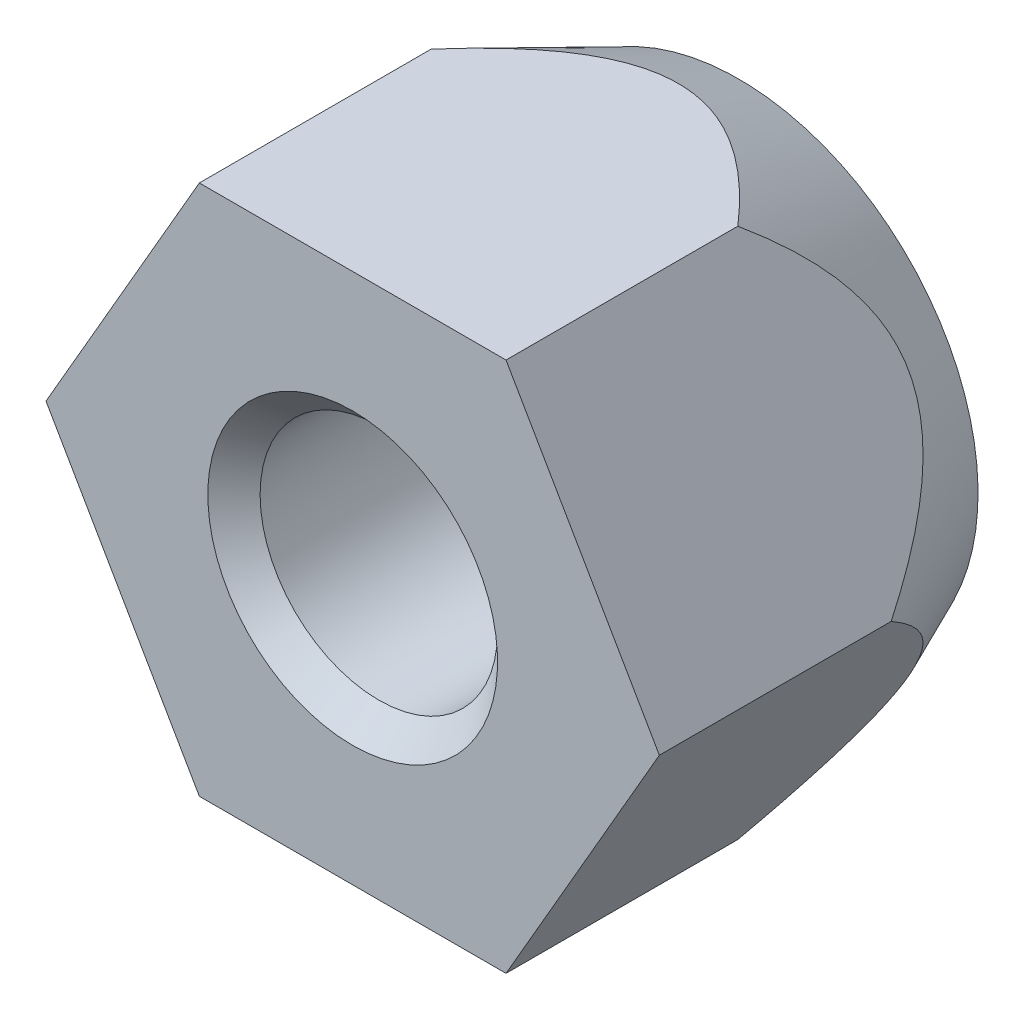
ISO-10303-21;
HEADER;
FILE_DESCRIPTION(('STEP AP214'),'2;1');
FILE_NAME('part.step','',(''),(''),'','','');
FILE_SCHEMA(('AUTOMOTIVE_DESIGN { 1 0 10303 214 1 1 1 1 }'));
ENDSEC;
DATA;
#1=APPLICATION_CONTEXT('core data for automotive mechanical design processes');
#2=APPLICATION_PROTOCOL_DEFINITION('international standard','automotive_design',2000,#1);
#3=PRODUCT_CONTEXT('',#1,'mechanical');
#4=PRODUCT('Part','Part','',(#3));
#5=PRODUCT_RELATED_PRODUCT_CATEGORY('part','',(#4));
#6=PRODUCT_DEFINITION_FORMATION('','',#4);
#7=PRODUCT_DEFINITION_CONTEXT('part definition',#1,'design');
#8=PRODUCT_DEFINITION('design','',#6,#7);
#9=PRODUCT_DEFINITION_SHAPE('','',#8);
#10=(LENGTH_UNIT() NAMED_UNIT(*) SI_UNIT(.MILLI.,.METRE.));
#11=(NAMED_UNIT(*) PLANE_ANGLE_UNIT() SI_UNIT($,.RADIAN.));
#12=(NAMED_UNIT(*) SI_UNIT($,.STERADIAN.) SOLID_ANGLE_UNIT());
#13=UNCERTAINTY_MEASURE_WITH_UNIT(LENGTH_MEASURE(1.E-05),#10,'distance_accuracy_value','');
#14=(GEOMETRIC_REPRESENTATION_CONTEXT(3) GLOBAL_UNCERTAINTY_ASSIGNED_CONTEXT((#13)) GLOBAL_UNIT_ASSIGNED_CONTEXT((#10,
#11,#12)) REPRESENTATION_CONTEXT('',''));
#15=CARTESIAN_POINT('',(0.,0.,0.));
#16=DIRECTION('',(0.,0.,1.));
#17=DIRECTION('',(1.,0.,0.));
#18=AXIS2_PLACEMENT_3D('',#15,#16,#17);
#19=CARTESIAN_POINT('',(1.5877125,2.7499987178122,-4.));
#20=DIRECTION('',(-0.866025403784438,-0.5,0.));
#21=DIRECTION('',(-0.5,0.866025403784439,0.));
#22=AXIS2_PLACEMENT_3D('',#19,#20,#21);
#23=PLANE('',#22);
#24=CARTESIAN_POINT('',(1.58771162446911,2.75000023427618,-2.399998));
#25=CARTESIAN_POINT('',(1.60310770754918,2.72333343614396,-2.43516350072012));
#26=CARTESIAN_POINT('',(1.61869154074512,2.6963414452719,-2.4699996868728));
#27=CARTESIAN_POINT('',(1.65028446627912,2.64162089308727,-2.53890977045152));
#28=CARTESIAN_POINT('',(1.66629368050588,2.61389212065727,-2.57298344412069));
#29=CARTESIAN_POINT('',(1.71525469450568,2.52908915681953,-2.67435959406448));
#30=CARTESIAN_POINT('',(1.74891920766384,2.47078050961753,-2.74030673801197));
#31=CARTESIAN_POINT('',(1.81981394050737,2.34798723034352,-2.86945688409846));
#32=CARTESIAN_POINT('',(1.85712879987133,2.28335599804785,-2.93247626108965));
#33=CARTESIAN_POINT('',(1.93469295394802,2.14901094234092,-3.05048227661869));
#34=CARTESIAN_POINT('',(1.97493218931774,2.07931454222285,-3.10549466349525));
#35=CARTESIAN_POINT('',(2.05130961529552,1.94702495987799,-3.1949305649157));
#36=CARTESIAN_POINT('',(2.08687336140756,1.88542674470447,-3.23127830379709));
#37=CARTESIAN_POINT('',(2.16008694403933,1.75861709978209,-3.29294193808089));
#38=CARTESIAN_POINT('',(2.19771990730494,1.69343489536668,-3.31833541803646));
#39=CARTESIAN_POINT('',(2.27530846235096,1.55904757594112,-3.35557240045519));
#40=CARTESIAN_POINT('',(2.3152907771711,1.48979617526843,-3.36720268887337));
#41=CARTESIAN_POINT('',(2.39564121698592,1.35062513109865,-3.3741594113299));
#42=CARTESIAN_POINT('',(2.43600944388658,1.28070531109524,-3.36948141327948));
#43=CARTESIAN_POINT('',(2.50994038252395,1.15265316912405,-3.34643657091398));
#44=CARTESIAN_POINT('',(2.54366847800623,1.09423439410621,-3.33006498957134));
#45=CARTESIAN_POINT('',(2.60957879236017,0.980074380902352,-3.28777521974059));
#46=CARTESIAN_POINT('',(2.64175981137018,0.924335220937676,-3.26184975241651));
#47=CARTESIAN_POINT('',(2.72934328345191,0.772636197388834,-3.17890057324615));
#48=CARTESIAN_POINT('',(2.7827531965352,0.680127514300735,-3.11358096697681));
#49=CARTESIAN_POINT('',(2.88452836409291,0.503847753141946,-2.96841709245939));
#50=CARTESIAN_POINT('',(2.93286320442841,0.420129353905126,-2.88849234042751));
#51=CARTESIAN_POINT('',(3.01410562020114,0.279413362057125,-2.74052719974376));
#52=CARTESIAN_POINT('',(3.04789124222314,0.220894948149705,-2.6743737303716));
#53=CARTESIAN_POINT('',(3.11315520079641,0.107854455997726,-2.53917870657911));
#54=CARTESIAN_POINT('',(3.14465646201646,0.0532926710621017,-2.47018164225687));
#55=CARTESIAN_POINT('',(3.17542587553089,-1.51646398329143E-06,-2.399998));
#56=B_SPLINE_CURVE_WITH_KNOTS('',3,(#24,#25,#26,#27,#28,#29,#30,#31,#32,#33,#34,#35,#36,#37,#38,
#39,#40,#41,#42,#43,#44,#45,#46,#47,#48,#49,#50,#51,#52,#53,#54,#55),.UNSPECIFIED.,.F.,.F.,(4,2,
2,2,2,2,2,2,2,2,2,2,2,2,2,4),(0.,0.140219214652364,0.280479050481833,0.563020685648127,
0.855709989314344,1.14743623923759,1.38640310096866,1.62364850196812,1.86452301292057,
2.10546299123102,2.31287808040015,2.52045152107709,2.89389138227835,3.26945484953458,
3.55299005498283,3.83310341091259),.UNSPECIFIED.);
#57=CARTESIAN_POINT('',(1.5877125,2.7499987178122,-2.4));
#58=VERTEX_POINT('',#57);
#59=CARTESIAN_POINT('',(3.175425,0.,-2.4));
#60=VERTEX_POINT('',#59);
#61=EDGE_CURVE('E84',#58,#60,#56,.T.);
#62=ORIENTED_EDGE('',*,*,#61,.F.);
#63=DIRECTION('',(0.,0.,1.));
#64=VECTOR('',#63,1.);
#65=CARTESIAN_POINT('',(1.5877125,2.7499987178122,-4.));
#66=LINE('',#65,#64);
#67=CARTESIAN_POINT('',(1.5877125,2.7499987178122,0.));
#68=VERTEX_POINT('',#67);
#69=EDGE_CURVE('E69',#58,#68,#66,.T.);
#70=ORIENTED_EDGE('',*,*,#69,.T.);
#71=DIRECTION('',(0.5,-0.866025403784438,0.));
#72=VECTOR('',#71,1.);
#73=CARTESIAN_POINT('',(1.5877125,2.7499987178122,0.));
#74=LINE('',#73,#72);
#75=CARTESIAN_POINT('',(3.175425,0.,0.));
#76=VERTEX_POINT('',#75);
#77=EDGE_CURVE('E87',#68,#76,#74,.T.);
#78=ORIENTED_EDGE('',*,*,#77,.T.);
#79=DIRECTION('',(0.,0.,1.));
#80=VECTOR('',#79,1.);
#81=CARTESIAN_POINT('',(3.175425,0.,-4.));
#82=LINE('',#81,#80);
#83=EDGE_CURVE('E11',#60,#76,#82,.T.);
#84=ORIENTED_EDGE('',*,*,#83,.F.);
#85=EDGE_LOOP('',(#62,#70,#78,#84));
#86=FACE_BOUND('',#85,.T.);
#87=ADVANCED_FACE('F16',(#86),#23,.F.);
#88=CARTESIAN_POINT('',(3.175425,0.,-4.));
#89=DIRECTION('',(-0.866025403784439,0.5,0.));
#90=DIRECTION('',(0.5,0.866025403784439,0.));
#91=AXIS2_PLACEMENT_3D('',#88,#89,#90);
#92=PLANE('',#91);
#93=CARTESIAN_POINT('',(3.17542587553089,1.51646398171315E-06,-2.399998));
#94=CARTESIAN_POINT('',(3.16002979245082,-0.0266652816682433,-2.43516350072012));
#95=CARTESIAN_POINT('',(3.14444595925488,-0.0536572725403014,-2.4699996868728));
#96=CARTESIAN_POINT('',(3.11285303372088,-0.108377824724928,-2.53890977045152));
#97=CARTESIAN_POINT('',(3.09684381949412,-0.136106597154928,-2.57298344412069));
#98=CARTESIAN_POINT('',(3.04788280549432,-0.220909560992671,-2.67435959406448));
#99=CARTESIAN_POINT('',(3.01421829233616,-0.279218208194672,-2.74030673801197));
#100=CARTESIAN_POINT('',(2.94332355949263,-0.402011487468687,-2.86945688409846));
#101=CARTESIAN_POINT('',(2.90600870012867,-0.466642719764355,-2.93247626108965));
#102=CARTESIAN_POINT('',(2.82844454605198,-0.600987775471279,-3.05048227661869));
#103=CARTESIAN_POINT('',(2.78820531068226,-0.670684175589358,-3.10549466349525));
#104=CARTESIAN_POINT('',(2.71182788470448,-0.802973757934211,-3.1949305649157));
#105=CARTESIAN_POINT('',(2.67626413859244,-0.864571973107733,-3.23127830379709));
#106=CARTESIAN_POINT('',(2.60305055596067,-0.991381618030106,-3.29294193808089));
#107=CARTESIAN_POINT('',(2.56541759269506,-1.05656382244552,-3.31833541803646));
#108=CARTESIAN_POINT('',(2.48782903764904,-1.19095114187108,-3.35557240045519));
#109=CARTESIAN_POINT('',(2.4478467228289,-1.26020254254377,-3.36720268887337));
#110=CARTESIAN_POINT('',(2.36749628301408,-1.39937358671355,-3.3741594113299));
#111=CARTESIAN_POINT('',(2.32712805611342,-1.46929340671697,-3.36948141327948));
#112=CARTESIAN_POINT('',(2.25319711747604,-1.59734554868815,-3.34643657091397));
#113=CARTESIAN_POINT('',(2.21946902199376,-1.655764323706,-3.33006498957133));
#114=CARTESIAN_POINT('',(2.15355870763983,-1.76992433690985,-3.28777521974059));
#115=CARTESIAN_POINT('',(2.12137768862982,-1.82566349687453,-3.26184975241651));
#116=CARTESIAN_POINT('',(2.03379421654809,-1.97736252042337,-3.17890057324615));
#117=CARTESIAN_POINT('',(1.9803843034648,-2.06987120351147,-3.11358096697681));
#118=CARTESIAN_POINT('',(1.87860913590709,-2.24615096467026,-2.96841709245939));
#119=CARTESIAN_POINT('',(1.83027429557158,-2.32986936390708,-2.88849234042751));
#120=CARTESIAN_POINT('',(1.74903187979886,-2.47058535575508,-2.74052719974376));
#121=CARTESIAN_POINT('',(1.71524625777686,-2.5291037696625,-2.6743737303716));
#122=CARTESIAN_POINT('',(1.64998229920359,-2.64214426181448,-2.53917870657911));
#123=CARTESIAN_POINT('',(1.61848103798354,-2.6967060467501,-2.47018164225686));
#124=CARTESIAN_POINT('',(1.58771162446911,-2.75000023427618,-2.399998));
#125=B_SPLINE_CURVE_WITH_KNOTS('',3,(#93,#94,#95,#96,#97,#98,#99,#100,#101,#102,#103,#104,#105,
#106,#107,#108,#109,#110,#111,#112,#113,#114,#115,#116,#117,#118,#119,#120,#121,#122,#123,#124),
.UNSPECIFIED.,.F.,.F.,(4,2,2,2,2,2,2,2,2,2,2,2,2,2,2,4),(0.,0.140219214652364,0.280479050481833,
0.563020685648127,0.855709989314345,1.14743623923759,1.38640310096866,1.62364850196812,
1.86452301292057,2.10546299123102,2.31287808040015,2.52045152107709,2.89389138227835,
3.26945484953458,3.55299005498283,3.83310341091258),.UNSPECIFIED.);
#126=CARTESIAN_POINT('',(1.5877125,-2.7499987178122,-2.4));
#127=VERTEX_POINT('',#126);
#128=EDGE_CURVE('E31',#60,#127,#125,.T.);
#129=ORIENTED_EDGE('',*,*,#128,.F.);
#130=ORIENTED_EDGE('',*,*,#83,.T.);
#131=DIRECTION('',(-0.5,-0.866025403784439,0.));
#132=VECTOR('',#131,1.);
#133=CARTESIAN_POINT('',(3.175425,0.,0.));
#134=LINE('',#133,#132);
#135=CARTESIAN_POINT('',(1.5877125,-2.7499987178122,0.));
#136=VERTEX_POINT('',#135);
#137=EDGE_CURVE('E308',#76,#136,#134,.T.);
#138=ORIENTED_EDGE('',*,*,#137,.T.);
#139=DIRECTION('',(0.,0.,1.));
#140=VECTOR('',#139,1.);
#141=CARTESIAN_POINT('',(1.5877125,-2.7499987178122,-4.));
#142=LINE('',#141,#140);
#143=EDGE_CURVE('E25',#127,#136,#142,.T.);
#144=ORIENTED_EDGE('',*,*,#143,.F.);
#145=EDGE_LOOP('',(#129,#130,#138,#144));
#146=FACE_BOUND('',#145,.T.);
#147=ADVANCED_FACE('F158',(#146),#92,.F.);
#148=CARTESIAN_POINT('',(1.5877125,-2.7499987178122,-4.));
#149=DIRECTION('',(0.,1.,0.));
#150=DIRECTION('',(1.,0.,0.));
#151=AXIS2_PLACEMENT_3D('',#148,#149,#150);
#152=PLANE('',#151);
#153=CARTESIAN_POINT('',(-2.82688364878311,-2.7499987178122,-0.644720390647707));
#154=CARTESIAN_POINT('',(-2.77042348118378,-2.7499987178122,-0.737144879062587));
#155=CARTESIAN_POINT('',(-2.71338093303943,-2.7499987178122,-0.829219048182246));
#156=CARTESIAN_POINT('',(-2.59788143875118,-2.7499987178122,-1.01250865831265));
#157=CARTESIAN_POINT('',(-2.53942412704568,-2.7499987178122,-1.10372386873356));
#158=CARTESIAN_POINT('',(-2.42026351679757,-2.7499987178122,-1.28602405757194));
#159=CARTESIAN_POINT('',(-2.3595432745047,-2.7499987178122,-1.37709799475052));
#160=CARTESIAN_POINT('',(-2.23611909676604,-2.7499987178122,-1.55787963379908));
#161=CARTESIAN_POINT('',(-2.1734153961086,-2.7499987178122,-1.64758749552727));
#162=CARTESIAN_POINT('',(-2.04080895391195,-2.7499987178122,-1.83195898169779));
#163=CARTESIAN_POINT('',(-1.97071923500158,-2.7499987178122,-1.92648874969787));
#164=CARTESIAN_POINT('',(-1.82710591146833,-2.7499987178122,-2.11289913533671));
#165=CARTESIAN_POINT('',(-1.75358284285619,-2.7499987178122,-2.20478016289546));
#166=CARTESIAN_POINT('',(-1.60250672090551,-2.7499987178122,-2.38453117779101));
#167=CARTESIAN_POINT('',(-1.52497191566971,-2.7499987178122,-2.47241640828885));
#168=CARTESIAN_POINT('',(-1.36442290871233,-2.7499987178122,-2.64299189601321));
#169=CARTESIAN_POINT('',(-1.28141376879141,-2.7499987178122,-2.72568681804867));
#170=CARTESIAN_POINT('',(-1.15188147005702,-2.7499987178122,-2.84358486027915));
#171=CARTESIAN_POINT('',(-1.1080384755649,-2.7499987178122,-2.88173059238104));
#172=CARTESIAN_POINT('',(-1.01833468271688,-2.7499987178122,-2.95562623578186));
#173=CARTESIAN_POINT('',(-0.972473101754242,-2.7499987178122,-2.99137520405734));
#174=CARTESIAN_POINT('',(-0.878860734294628,-2.7499987178122,-3.05958188889659));
#175=CARTESIAN_POINT('',(-0.831126375369222,-2.7499987178122,-3.09206193429232));
#176=CARTESIAN_POINT('',(-0.733292096526439,-2.7499987178122,-3.15320452547621));
#177=CARTESIAN_POINT('',(-0.683193346308942,-2.7499987178122,-3.18186893265026));
#178=CARTESIAN_POINT('',(-0.562894846231666,-2.7499987178122,-3.2434000086083));
#179=CARTESIAN_POINT('',(-0.491681874326186,-2.7499987178122,-3.27434944071958));
#180=CARTESIAN_POINT('',(-0.345244211512263,-2.7499987178122,-3.32464997473509));
#181=CARTESIAN_POINT('',(-0.270024710925547,-2.7499987178122,-3.34401570323426));
#182=CARTESIAN_POINT('',(-0.116450521475255,-2.7499987178122,-3.36863062656873));
#183=CARTESIAN_POINT('',(-0.0380724208464443,-2.7499987178122,-3.37374039433587));
#184=CARTESIAN_POINT('',(0.118159929234121,-2.7499987178122,-3.3685535073509));
#185=CARTESIAN_POINT('',(0.196014053367416,-2.7499987178122,-3.35825328996217));
#186=CARTESIAN_POINT('',(0.357074960670175,-2.7499987178122,-3.32202154284974));
#187=CARTESIAN_POINT('',(0.439903747334559,-2.7499987178122,-3.29446752907141));
#188=CARTESIAN_POINT('',(0.600109064674006,-2.7499987178122,-3.22651375304557));
#189=CARTESIAN_POINT('',(0.677472243525357,-2.7499987178122,-3.18608377786454));
#190=CARTESIAN_POINT('',(0.819361637318472,-2.7499987178122,-3.100583713432));
#191=CARTESIAN_POINT('',(0.884404473486118,-2.7499987178122,-3.05634784540156));
#192=CARTESIAN_POINT('',(1.01052937748537,-2.7499987178122,-2.96250081600963));
#193=CARTESIAN_POINT('',(1.07160772241582,-2.7499987178122,-2.91288471576197));
#194=CARTESIAN_POINT('',(1.19086312526903,-2.7499987178122,-2.80926890182119));
#195=CARTESIAN_POINT('',(1.24900879652108,-2.7499987178122,-2.75523346925237));
#196=CARTESIAN_POINT('',(1.36232362988999,-2.7499987178122,-2.64421053428371));
#197=CARTESIAN_POINT('',(1.41749440333187,-2.7499987178122,-2.5872246634255));
#198=CARTESIAN_POINT('',(1.52819182425455,-2.7499987178122,-2.46792735679908));
#199=CARTESIAN_POINT('',(1.58358563856184,-2.7499987178122,-2.4054933303908));
#200=CARTESIAN_POINT('',(1.69208656074325,-2.7499987178122,-2.27866312672872));
#201=CARTESIAN_POINT('',(1.74519330027241,-2.7499987178122,-2.21426663624093));
#202=CARTESIAN_POINT('',(1.90170400659737,-2.7499987178122,-2.01869084700874));
#203=CARTESIAN_POINT('',(2.00222511903021,-2.7499987178122,-1.88520657508039));
#204=CARTESIAN_POINT('',(2.19802042611811,-2.7499987178122,-1.61373851900484));
#205=CARTESIAN_POINT('',(2.29327344163132,-2.7499987178122,-1.47573968660407));
#206=CARTESIAN_POINT('',(2.47952525010072,-2.7499987178122,-1.19688654314757));
#207=CARTESIAN_POINT('',(2.57052350410901,-2.7499987178122,-1.05603187356699));
#208=CARTESIAN_POINT('',(2.74136679859907,-2.7499987178122,-0.784704397860818));
#209=CARTESIAN_POINT('',(2.82148970608582,-2.7499987178122,-0.654405575422867));
#210=CARTESIAN_POINT('',(2.97951304815934,-2.7499987178122,-0.392449278039275));
#211=CARTESIAN_POINT('',(3.05741322555143,-2.7499987178122,-0.260791648245298));
#212=CARTESIAN_POINT('',(3.21070864388621,-2.7499987178122,0.0024322371766358));
#213=CARTESIAN_POINT('',(3.28611982747211,-2.7499987178122,0.1339892341991));
#214=CARTESIAN_POINT('',(3.43540958863565,-2.7499987178122,0.397934633843802));
#215=CARTESIAN_POINT('',(3.50928848136695,-2.7499987178122,0.530322858057896));
#216=CARTESIAN_POINT('',(3.5825506059369,-2.7499987178122,0.663047059545303));
#217=B_SPLINE_CURVE_WITH_KNOTS('',3,(#153,#154,#155,#156,#157,#158,#159,#160,#161,#162,#163,
#164,#165,#166,#167,#168,#169,#170,#171,#172,#173,#174,#175,#176,#177,#178,#179,#180,#181,#182,
#183,#184,#185,#186,#187,#188,#189,#190,#191,#192,#193,#194,#195,#196,#197,#198,#199,#200,#201,
#202,#203,#204,#205,#206,#207,#208,#209,#210,#211,#212,#213,#214,#215,#216),.UNSPECIFIED.,.F.,
.F.,(4,2,2,2,2,2,2,2,2,2,2,2,2,2,2,2,2,2,2,2,2,2,2,2,2,2,2,2,2,2,2,4),(0.,0.324920645130666,
0.649926162487292,0.9782829272081,1.3066009676714,1.65957881401293,2.0125017368822,
2.36394046851333,2.7150586816464,2.88933654589598,3.06368258338152,3.23674280248386,
3.40971828564244,3.64187054171188,3.87372903986793,4.10784735710957,4.34201980856244,
4.60243685193918,4.86346951239244,5.09910419956633,5.33495705311046,5.57295187956798,
5.81081647610127,6.06114497014971,6.31151363123599,6.81257893936562,7.31553072391507,
7.81854604539901,8.2774076575407,8.73632215152734,9.191225690197,9.64603471977102),.UNSPECIFIED.);
#218=CARTESIAN_POINT('',(-1.5877125,-2.7499987178122,-2.4));
#219=VERTEX_POINT('',#218);
#220=EDGE_CURVE('E39',#127,#219,#217,.F.);
#221=ORIENTED_EDGE('',*,*,#220,.F.);
#222=ORIENTED_EDGE('',*,*,#143,.T.);
#223=DIRECTION('',(-1.,0.,0.));
#224=VECTOR('',#223,1.);
#225=CARTESIAN_POINT('',(1.5877125,-2.7499987178122,0.));
#226=LINE('',#225,#224);
#227=CARTESIAN_POINT('',(-1.5877125,-2.7499987178122,0.));
#228=VERTEX_POINT('',#227);
#229=EDGE_CURVE('E324',#136,#228,#226,.T.);
#230=ORIENTED_EDGE('',*,*,#229,.T.);
#231=DIRECTION('',(0.,0.,1.));
#232=VECTOR('',#231,1.);
#233=CARTESIAN_POINT('',(-1.5877125,-2.7499987178122,-4.));
#234=LINE('',#233,#232);
#235=EDGE_CURVE('E315',#219,#228,#234,.T.);
#236=ORIENTED_EDGE('',*,*,#235,.F.);
#237=EDGE_LOOP('',(#221,#222,#230,#236));
#238=FACE_BOUND('',#237,.T.);
#239=ADVANCED_FACE('F161',(#238),#152,.F.);
#240=CARTESIAN_POINT('',(-1.5877125,-2.7499987178122,-4.));
#241=DIRECTION('',(0.866025403784439,0.5,0.));
#242=DIRECTION('',(0.5,-0.866025403784439,0.));
#243=AXIS2_PLACEMENT_3D('',#240,#241,#242);
#244=PLANE('',#243);
#245=CARTESIAN_POINT('',(-1.58771162446911,-2.75000023427618,-2.399998));
#246=CARTESIAN_POINT('',(-1.60310770754918,-2.72333343614396,-2.43516350072013));
#247=CARTESIAN_POINT('',(-1.61869154074512,-2.6963414452719,-2.4699996868728));
#248=CARTESIAN_POINT('',(-1.65028446627912,-2.64162089308727,-2.53890977045152));
#249=CARTESIAN_POINT('',(-1.66629368050588,-2.61389212065727,-2.57298344412069));
#250=CARTESIAN_POINT('',(-1.71525469450568,-2.52908915681953,-2.67435959406448));
#251=CARTESIAN_POINT('',(-1.74891920766384,-2.47078050961753,-2.74030673801197));
#252=CARTESIAN_POINT('',(-1.81981394050737,-2.34798723034352,-2.86945688409846));
#253=CARTESIAN_POINT('',(-1.85712879987133,-2.28335599804785,-2.93247626108965));
#254=CARTESIAN_POINT('',(-1.93469295394802,-2.14901094234092,-3.05048227661869));
#255=CARTESIAN_POINT('',(-1.97493218931774,-2.07931454222285,-3.10549466349525));
#256=CARTESIAN_POINT('',(-2.05130961529552,-1.94702495987799,-3.1949305649157));
#257=CARTESIAN_POINT('',(-2.08687336140755,-1.88542674470447,-3.23127830379709));
#258=CARTESIAN_POINT('',(-2.16008694403933,-1.7586170997821,-3.29294193808089));
#259=CARTESIAN_POINT('',(-2.19771990730494,-1.69343489536668,-3.31833541803646));
#260=CARTESIAN_POINT('',(-2.27530846235096,-1.55904757594112,-3.35557240045519));
#261=CARTESIAN_POINT('',(-2.31529077717109,-1.48979617526843,-3.36720268887337));
#262=CARTESIAN_POINT('',(-2.39564121698592,-1.35062513109865,-3.3741594113299));
#263=CARTESIAN_POINT('',(-2.43600944388658,-1.28070531109524,-3.36948141327948));
#264=CARTESIAN_POINT('',(-2.50994038252396,-1.15265316912405,-3.34643657091398));
#265=CARTESIAN_POINT('',(-2.54366847800624,-1.09423439410621,-3.33006498957134));
#266=CARTESIAN_POINT('',(-2.60957879236017,-0.98007438090235,-3.28777521974059));
#267=CARTESIAN_POINT('',(-2.64175981137018,-0.924335220937675,-3.26184975241651));
#268=CARTESIAN_POINT('',(-2.72934328345191,-0.772636197388835,-3.17890057324615));
#269=CARTESIAN_POINT('',(-2.7827531965352,-0.680127514300733,-3.11358096697681));
#270=CARTESIAN_POINT('',(-2.88452836409291,-0.503847753141944,-2.96841709245939));
#271=CARTESIAN_POINT('',(-2.93286320442841,-0.420129353905126,-2.88849234042751));
#272=CARTESIAN_POINT('',(-3.01410562020114,-0.279413362057125,-2.74052719974376));
#273=CARTESIAN_POINT('',(-3.04789124222314,-0.220894948149703,-2.6743737303716));
#274=CARTESIAN_POINT('',(-3.11315520079641,-0.107854455997724,-2.53917870657912));
#275=CARTESIAN_POINT('',(-3.14465646201646,-0.0532926710621001,-2.47018164225687));
#276=CARTESIAN_POINT('',(-3.17542587553089,1.51646398107086E-06,-2.399998));
#277=B_SPLINE_CURVE_WITH_KNOTS('',3,(#245,#246,#247,#248,#249,#250,#251,#252,#253,#254,#255,
#256,#257,#258,#259,#260,#261,#262,#263,#264,#265,#266,#267,#268,#269,#270,#271,#272,#273,#274,
#275,#276),.UNSPECIFIED.,.F.,.F.,(4,2,2,2,2,2,2,2,2,2,2,2,2,2,2,4),(0.,0.140219214652365,
0.280479050481834,0.563020685648127,0.855709989314344,1.14743623923759,1.38640310096866,
1.62364850196812,1.86452301292057,2.10546299123102,2.31287808040015,2.52045152107709,
2.89389138227835,3.26945484953458,3.55299005498283,3.83310341091259),.UNSPECIFIED.);
#278=CARTESIAN_POINT('',(-3.175425,0.,-2.4));
#279=VERTEX_POINT('',#278);
#280=EDGE_CURVE('E101',#219,#279,#277,.T.);
#281=ORIENTED_EDGE('',*,*,#280,.F.);
#282=ORIENTED_EDGE('',*,*,#235,.T.);
#283=DIRECTION('',(-0.5,0.866025403784439,0.));
#284=VECTOR('',#283,1.);
#285=CARTESIAN_POINT('',(-1.5877125,-2.7499987178122,0.));
#286=LINE('',#285,#284);
#287=CARTESIAN_POINT('',(-3.175425,0.,0.));
#288=VERTEX_POINT('',#287);
#289=EDGE_CURVE('E303',#228,#288,#286,.T.);
#290=ORIENTED_EDGE('',*,*,#289,.T.);
#291=DIRECTION('',(0.,0.,1.));
#292=VECTOR('',#291,1.);
#293=CARTESIAN_POINT('',(-3.175425,0.,-4.));
#294=LINE('',#293,#292);
#295=EDGE_CURVE('E312',#279,#288,#294,.T.);
#296=ORIENTED_EDGE('',*,*,#295,.F.);
#297=EDGE_LOOP('',(#281,#282,#290,#296));
#298=FACE_BOUND('',#297,.T.);
#299=ADVANCED_FACE('F164',(#298),#244,.F.);
#300=CARTESIAN_POINT('',(-3.175425,0.,-4.));
#301=DIRECTION('',(0.866025403784439,-0.5,0.));
#302=DIRECTION('',(-0.5,-0.866025403784439,0.));
#303=AXIS2_PLACEMENT_3D('',#300,#301,#302);
#304=PLANE('',#303);
#305=CARTESIAN_POINT('',(-3.17542587553089,-1.51646398268982E-06,-2.399998));
#306=CARTESIAN_POINT('',(-3.16002979245082,0.0266652816682424,-2.43516350072012));
#307=CARTESIAN_POINT('',(-3.14444595925488,0.0536572725403005,-2.4699996868728));
#308=CARTESIAN_POINT('',(-3.11285303372088,0.108377824724928,-2.53890977045152));
#309=CARTESIAN_POINT('',(-3.09684381949412,0.136106597154927,-2.57298344412069));
#310=CARTESIAN_POINT('',(-3.04788280549432,0.220909560992671,-2.67435959406448));
#311=CARTESIAN_POINT('',(-3.01421829233616,0.279218208194671,-2.74030673801197));
#312=CARTESIAN_POINT('',(-2.94332355949263,0.402011487468686,-2.86945688409846));
#313=CARTESIAN_POINT('',(-2.90600870012867,0.466642719764354,-2.93247626108965));
#314=CARTESIAN_POINT('',(-2.82844454605198,0.600987775471278,-3.05048227661869));
#315=CARTESIAN_POINT('',(-2.78820531068226,0.670684175589357,-3.10549466349525));
#316=CARTESIAN_POINT('',(-2.71182788470448,0.80297375793421,-3.1949305649157));
#317=CARTESIAN_POINT('',(-2.67626413859244,0.864571973107732,-3.23127830379709));
#318=CARTESIAN_POINT('',(-2.60305055596067,0.991381618030106,-3.29294193808089));
#319=CARTESIAN_POINT('',(-2.56541759269506,1.05656382244552,-3.31833541803646));
#320=CARTESIAN_POINT('',(-2.48782903764904,1.19095114187108,-3.35557240045519));
#321=CARTESIAN_POINT('',(-2.4478467228289,1.26020254254377,-3.36720268887337));
#322=CARTESIAN_POINT('',(-2.36749628301408,1.39937358671355,-3.3741594113299));
#323=CARTESIAN_POINT('',(-2.32712805611342,1.46929340671697,-3.36948141327948));
#324=CARTESIAN_POINT('',(-2.25319711747605,1.59734554868815,-3.34643657091398));
#325=CARTESIAN_POINT('',(-2.21946902199376,1.655764323706,-3.33006498957134));
#326=CARTESIAN_POINT('',(-2.15355870763983,1.76992433690985,-3.28777521974059));
#327=CARTESIAN_POINT('',(-2.12137768862982,1.82566349687453,-3.26184975241651));
#328=CARTESIAN_POINT('',(-2.03379421654809,1.97736252042337,-3.17890057324614));
#329=CARTESIAN_POINT('',(-1.9803843034648,2.06987120351147,-3.1135809669768));
#330=CARTESIAN_POINT('',(-1.87860913590709,2.24615096467026,-2.96841709245939));
#331=CARTESIAN_POINT('',(-1.83027429557159,2.32986936390708,-2.88849234042751));
#332=CARTESIAN_POINT('',(-1.74903187979886,2.47058535575508,-2.74052719974376));
#333=CARTESIAN_POINT('',(-1.71524625777686,2.5291037696625,-2.6743737303716));
#334=CARTESIAN_POINT('',(-1.64998229920359,2.64214426181448,-2.53917870657912));
#335=CARTESIAN_POINT('',(-1.61848103798354,2.6967060467501,-2.47018164225687));
#336=CARTESIAN_POINT('',(-1.58771162446911,2.75000023427618,-2.399998));
#337=B_SPLINE_CURVE_WITH_KNOTS('',3,(#305,#306,#307,#308,#309,#310,#311,#312,#313,#314,#315,
#316,#317,#318,#319,#320,#321,#322,#323,#324,#325,#326,#327,#328,#329,#330,#331,#332,#333,#334,
#335,#336),.UNSPECIFIED.,.F.,.F.,(4,2,2,2,2,2,2,2,2,2,2,2,2,2,2,4),(0.,0.140219214652365,
0.280479050481835,0.563020685648127,0.855709989314345,1.14743623923759,1.38640310096866,
1.62364850196812,1.86452301292057,2.10546299123102,2.31287808040015,2.52045152107709,
2.89389138227835,3.26945484953458,3.55299005498283,3.83310341091258),.UNSPECIFIED.);
#338=CARTESIAN_POINT('',(-1.5877125,2.7499987178122,-2.4));
#339=VERTEX_POINT('',#338);
#340=EDGE_CURVE('E92',#279,#339,#337,.T.);
#341=ORIENTED_EDGE('',*,*,#340,.F.);
#342=ORIENTED_EDGE('',*,*,#295,.T.);
#343=DIRECTION('',(0.5,0.866025403784439,0.));
#344=VECTOR('',#343,1.);
#345=CARTESIAN_POINT('',(-3.175425,0.,0.));
#346=LINE('',#345,#344);
#347=CARTESIAN_POINT('',(-1.5877125,2.7499987178122,0.));
#348=VERTEX_POINT('',#347);
#349=EDGE_CURVE('E299',#288,#348,#346,.T.);
#350=ORIENTED_EDGE('',*,*,#349,.T.);
#351=DIRECTION('',(0.,0.,1.));
#352=VECTOR('',#351,1.);
#353=CARTESIAN_POINT('',(-1.5877125,2.7499987178122,-4.));
#354=LINE('',#353,#352);
#355=EDGE_CURVE('E81',#339,#348,#354,.T.);
#356=ORIENTED_EDGE('',*,*,#355,.F.);
#357=EDGE_LOOP('',(#341,#342,#350,#356));
#358=FACE_BOUND('',#357,.T.);
#359=ADVANCED_FACE('F167',(#358),#304,.F.);
#360=CARTESIAN_POINT('',(-1.5877125,2.7499987178122,-4.));
#361=DIRECTION('',(0.,-1.,0.));
#362=DIRECTION('',(-1.,0.,0.));
#363=AXIS2_PLACEMENT_3D('',#360,#361,#362);
#364=PLANE('',#363);
#365=CARTESIAN_POINT('',(-2.82688364878311,2.7499987178122,-0.644720390647712));
#366=CARTESIAN_POINT('',(-2.77042348118378,2.7499987178122,-0.737144879062591));
#367=CARTESIAN_POINT('',(-2.71338093303943,2.7499987178122,-0.829219048182249));
#368=CARTESIAN_POINT('',(-2.59788143875118,2.7499987178122,-1.01250865831265));
#369=CARTESIAN_POINT('',(-2.53942412704568,2.7499987178122,-1.10372386873356));
#370=CARTESIAN_POINT('',(-2.42026351679757,2.7499987178122,-1.28602405757195));
#371=CARTESIAN_POINT('',(-2.3595432745047,2.7499987178122,-1.37709799475053));
#372=CARTESIAN_POINT('',(-2.23611909676603,2.7499987178122,-1.55787963379909));
#373=CARTESIAN_POINT('',(-2.1734153961086,2.7499987178122,-1.64758749552727));
#374=CARTESIAN_POINT('',(-2.04080895391194,2.7499987178122,-1.8319589816978));
#375=CARTESIAN_POINT('',(-1.97071923500158,2.7499987178122,-1.92648874969787));
#376=CARTESIAN_POINT('',(-1.82710591146833,2.7499987178122,-2.11289913533671));
#377=CARTESIAN_POINT('',(-1.75358284285619,2.7499987178122,-2.20478016289546));
#378=CARTESIAN_POINT('',(-1.60250672090551,2.7499987178122,-2.38453117779101));
#379=CARTESIAN_POINT('',(-1.52497191566971,2.7499987178122,-2.47241640828885));
#380=CARTESIAN_POINT('',(-1.36442290871233,2.7499987178122,-2.64299189601321));
#381=CARTESIAN_POINT('',(-1.28141376879141,2.7499987178122,-2.72568681804867));
#382=CARTESIAN_POINT('',(-1.15188147005702,2.7499987178122,-2.84358486027915));
#383=CARTESIAN_POINT('',(-1.10803847556491,2.7499987178122,-2.88173059238103));
#384=CARTESIAN_POINT('',(-1.01833468271688,2.7499987178122,-2.95562623578186));
#385=CARTESIAN_POINT('',(-0.972473101754243,2.7499987178122,-2.99137520405733));
#386=CARTESIAN_POINT('',(-0.878860734294629,2.7499987178122,-3.05958188889658));
#387=CARTESIAN_POINT('',(-0.831126375369223,2.7499987178122,-3.09206193429232));
#388=CARTESIAN_POINT('',(-0.733292096526441,2.7499987178122,-3.1532045254762));
#389=CARTESIAN_POINT('',(-0.683193346308945,2.7499987178122,-3.18186893265026));
#390=CARTESIAN_POINT('',(-0.562894846231669,2.7499987178122,-3.2434000086083));
#391=CARTESIAN_POINT('',(-0.491681874326188,2.7499987178122,-3.27434944071958));
#392=CARTESIAN_POINT('',(-0.345244211512264,2.7499987178122,-3.32464997473509));
#393=CARTESIAN_POINT('',(-0.270024710925549,2.7499987178122,-3.34401570323426));
#394=CARTESIAN_POINT('',(-0.116450521475258,2.7499987178122,-3.36863062656873));
#395=CARTESIAN_POINT('',(-0.0380724208464471,2.7499987178122,-3.37374039433586));
#396=CARTESIAN_POINT('',(0.118159929234119,2.7499987178122,-3.36855350735089));
#397=CARTESIAN_POINT('',(0.196014053367413,2.7499987178122,-3.35825328996217));
#398=CARTESIAN_POINT('',(0.357074960670173,2.7499987178122,-3.32202154284974));
#399=CARTESIAN_POINT('',(0.439903747334555,2.7499987178122,-3.29446752907141));
#400=CARTESIAN_POINT('',(0.600109064674002,2.7499987178122,-3.22651375304557));
#401=CARTESIAN_POINT('',(0.677472243525355,2.7499987178122,-3.18608377786454));
#402=CARTESIAN_POINT('',(0.819361637318469,2.7499987178122,-3.100583713432));
#403=CARTESIAN_POINT('',(0.884404473486114,2.7499987178122,-3.05634784540156));
#404=CARTESIAN_POINT('',(1.01052937748537,2.7499987178122,-2.96250081600963));
#405=CARTESIAN_POINT('',(1.07160772241582,2.7499987178122,-2.91288471576197));
#406=CARTESIAN_POINT('',(1.19086312526902,2.7499987178122,-2.80926890182119));
#407=CARTESIAN_POINT('',(1.24900879652108,2.7499987178122,-2.75523346925237));
#408=CARTESIAN_POINT('',(1.36232362988999,2.7499987178122,-2.64421053428371));
#409=CARTESIAN_POINT('',(1.41749440333187,2.7499987178122,-2.58722466342551));
#410=CARTESIAN_POINT('',(1.52819182425454,2.7499987178122,-2.46792735679909));
#411=CARTESIAN_POINT('',(1.58358563856183,2.7499987178122,-2.4054933303908));
#412=CARTESIAN_POINT('',(1.69208656074324,2.7499987178122,-2.27866312672872));
#413=CARTESIAN_POINT('',(1.7451933002724,2.7499987178122,-2.21426663624093));
#414=CARTESIAN_POINT('',(1.90170400659737,2.7499987178122,-2.01869084700875));
#415=CARTESIAN_POINT('',(2.0022251190302,2.7499987178122,-1.8852065750804));
#416=CARTESIAN_POINT('',(2.1980204261181,2.7499987178122,-1.61373851900484));
#417=CARTESIAN_POINT('',(2.29327344163131,2.7499987178122,-1.47573968660408));
#418=CARTESIAN_POINT('',(2.47952525010071,2.7499987178122,-1.19688654314758));
#419=CARTESIAN_POINT('',(2.570523504109,2.7499987178122,-1.056031873567));
#420=CARTESIAN_POINT('',(2.74136679859906,2.7499987178122,-0.784704397860828));
#421=CARTESIAN_POINT('',(2.82148970608581,2.7499987178122,-0.654405575422877));
#422=CARTESIAN_POINT('',(2.97951304815934,2.7499987178122,-0.392449278039285));
#423=CARTESIAN_POINT('',(3.05741322555142,2.7499987178122,-0.260791648245307));
#424=CARTESIAN_POINT('',(3.2107086438862,2.7499987178122,0.00243223717662585));
#425=CARTESIAN_POINT('',(3.2861198274721,2.7499987178122,0.13398923419909));
#426=CARTESIAN_POINT('',(3.43540958863563,2.7499987178122,0.397934633843791));
#427=CARTESIAN_POINT('',(3.50928848136694,2.7499987178122,0.530322858057886));
#428=CARTESIAN_POINT('',(3.58255060593689,2.7499987178122,0.663047059545293));
#429=B_SPLINE_CURVE_WITH_KNOTS('',3,(#365,#366,#367,#368,#369,#370,#371,#372,#373,#374,#375,
#376,#377,#378,#379,#380,#381,#382,#383,#384,#385,#386,#387,#388,#389,#390,#391,#392,#393,#394,
#395,#396,#397,#398,#399,#400,#401,#402,#403,#404,#405,#406,#407,#408,#409,#410,#411,#412,#413,
#414,#415,#416,#417,#418,#419,#420,#421,#422,#423,#424,#425,#426,#427,#428),.UNSPECIFIED.,.F.,
.F.,(4,2,2,2,2,2,2,2,2,2,2,2,2,2,2,2,2,2,2,2,2,2,2,2,2,2,2,2,2,2,2,4),(0.,0.324920645130666,
0.64992616248729,0.978282927208098,1.3066009676714,1.65957881401293,2.0125017368822,
2.36394046851333,2.7150586816464,2.88933654589598,3.06368258338151,3.23674280248385,
3.40971828564243,3.64187054171187,3.87372903986793,4.10784735710957,4.34201980856243,
4.60243685193917,4.86346951239243,5.09910419956632,5.33495705311045,5.57295187956797,
5.81081647610126,6.06114497014969,6.31151363123597,6.8125789393656,7.31553072391505,
7.81854604539899,8.27740765754068,8.73632215152732,9.19122569019698,9.646034719771),.UNSPECIFIED.);
#430=EDGE_CURVE('E73',#339,#58,#429,.T.);
#431=ORIENTED_EDGE('',*,*,#430,.F.);
#432=ORIENTED_EDGE('',*,*,#355,.T.);
#433=DIRECTION('',(1.,0.,0.));
#434=VECTOR('',#433,1.);
#435=CARTESIAN_POINT('',(-1.5877125,2.7499987178122,0.));
#436=LINE('',#435,#434);
#437=EDGE_CURVE('E76',#348,#68,#436,.T.);
#438=ORIENTED_EDGE('',*,*,#437,.T.);
#439=ORIENTED_EDGE('',*,*,#69,.F.);
#440=EDGE_LOOP('',(#431,#432,#438,#439));
#441=FACE_BOUND('',#440,.T.);
#442=ADVANCED_FACE('F71',(#441),#364,.F.);
#443=CARTESIAN_POINT('',(3.175425,0.,0.));
#444=DIRECTION('',(0.,0.,-1.));
#445=DIRECTION('',(1.,0.,0.));
#446=AXIS2_PLACEMENT_3D('',#443,#444,#445);
#447=PLANE('',#446);
#448=CARTESIAN_POINT('',(0.,0.,0.));
#449=DIRECTION('',(0.,0.,1.));
#450=DIRECTION('',(0.,-1.,0.));
#451=AXIS2_PLACEMENT_3D('',#448,#449,#450);
#452=CIRCLE('',#451,1.5);
#453=CARTESIAN_POINT('',(0.,-1.5,0.));
#454=VERTEX_POINT('',#453);
#455=EDGE_CURVE('E105',#454,#454,#452,.T.);
#456=ORIENTED_EDGE('',*,*,#455,.F.);
#457=EDGE_LOOP('',(#456));
#458=FACE_BOUND('',#457,.T.);
#459=ORIENTED_EDGE('',*,*,#77,.F.);
#460=ORIENTED_EDGE('',*,*,#437,.F.);
#461=ORIENTED_EDGE('',*,*,#349,.F.);
#462=ORIENTED_EDGE('',*,*,#289,.F.);
#463=ORIENTED_EDGE('',*,*,#229,.F.);
#464=ORIENTED_EDGE('',*,*,#137,.F.);
#465=EDGE_LOOP('',(#459,#460,#461,#462,#463,#464));
#466=FACE_BOUND('',#465,.T.);
#467=ADVANCED_FACE('F127',(#458,#466),#447,.F.);
#468=CARTESIAN_POINT('',(0.,0.,-2.4));
#469=DIRECTION('',(0.,0.,1.));
#470=DIRECTION('',(0.,-1.,0.));
#471=AXIS2_PLACEMENT_3D('',#468,#469,#470);
#472=CONICAL_SURFACE('',#471,3.175425,0.412633370668645);
#473=CARTESIAN_POINT('',(0.,0.,-4.));
#474=DIRECTION('',(0.,0.,1.));
#475=DIRECTION('',(0.,-1.,0.));
#476=AXIS2_PLACEMENT_3D('',#473,#474,#475);
#477=CIRCLE('',#476,2.475);
#478=CARTESIAN_POINT('',(0.,-2.475,-4.));
#479=VERTEX_POINT('',#478);
#480=EDGE_CURVE('E94',#479,#479,#477,.T.);
#481=ORIENTED_EDGE('',*,*,#480,.T.);
#482=EDGE_LOOP('',(#481));
#483=FACE_BOUND('',#482,.T.);
#484=ORIENTED_EDGE('',*,*,#430,.T.);
#485=ORIENTED_EDGE('',*,*,#61,.T.);
#486=ORIENTED_EDGE('',*,*,#128,.T.);
#487=ORIENTED_EDGE('',*,*,#220,.T.);
#488=ORIENTED_EDGE('',*,*,#280,.T.);
#489=ORIENTED_EDGE('',*,*,#340,.T.);
#490=EDGE_LOOP('',(#484,#485,#486,#487,#488,#489));
#491=FACE_BOUND('',#490,.T.);
#492=ADVANCED_FACE('F90',(#483,#491),#472,.T.);
#493=CARTESIAN_POINT('',(3.175425,0.,-4.));
#494=DIRECTION('',(0.,0.,-1.));
#495=DIRECTION('',(1.,0.,0.));
#496=AXIS2_PLACEMENT_3D('',#493,#494,#495);
#497=PLANE('',#496);
#498=CARTESIAN_POINT('',(0.,0.,-4.));
#499=DIRECTION('',(0.,0.,1.));
#500=DIRECTION('',(0.,-1.,0.));
#501=AXIS2_PLACEMENT_3D('',#498,#499,#500);
#502=CIRCLE('',#501,1.5);
#503=CARTESIAN_POINT('',(0.,-1.5,-4.));
#504=VERTEX_POINT('',#503);
#505=EDGE_CURVE('E281',#504,#504,#502,.T.);
#506=ORIENTED_EDGE('',*,*,#505,.T.);
#507=EDGE_LOOP('',(#506));
#508=FACE_BOUND('',#507,.T.);
#509=ORIENTED_EDGE('',*,*,#480,.F.);
#510=EDGE_LOOP('',(#509));
#511=FACE_BOUND('',#510,.T.);
#512=ADVANCED_FACE('F126',(#508,#511),#497,.T.);
#513=CARTESIAN_POINT('',(0.,0.,0.));
#514=DIRECTION('',(0.,0.,1.));
#515=DIRECTION('',(0.,-1.,0.));
#516=AXIS2_PLACEMENT_3D('',#513,#514,#515);
#517=CONICAL_SURFACE('',#516,1.5,0.785398163397449);
#518=CARTESIAN_POINT('',(0.,0.,-0.270625));
#519=DIRECTION('',(0.,0.,1.));
#520=DIRECTION('',(0.,-1.,0.));
#521=AXIS2_PLACEMENT_3D('',#518,#519,#520);
#522=CIRCLE('',#521,1.229375);
#523=CARTESIAN_POINT('',(0.,-1.229375,-0.270625));
#524=VERTEX_POINT('',#523);
#525=EDGE_CURVE('E280',#524,#524,#522,.T.);
#526=ORIENTED_EDGE('',*,*,#525,.F.);
#527=EDGE_LOOP('',(#526));
#528=FACE_BOUND('',#527,.T.);
#529=ORIENTED_EDGE('',*,*,#455,.T.);
#530=EDGE_LOOP('',(#529));
#531=FACE_BOUND('',#530,.T.);
#532=ADVANCED_FACE('F129',(#528,#531),#517,.F.);
#533=CARTESIAN_POINT('',(0.,0.,0.));
#534=DIRECTION('',(0.,0.,1.));
#535=DIRECTION('',(0.,-1.,0.));
#536=AXIS2_PLACEMENT_3D('',#533,#534,#535);
#537=CYLINDRICAL_SURFACE('',#536,1.229375);
#538=CARTESIAN_POINT('',(0.,0.,-3.729375));
#539=DIRECTION('',(0.,0.,1.));
#540=DIRECTION('',(0.,-1.,0.));
#541=AXIS2_PLACEMENT_3D('',#538,#539,#540);
#542=CIRCLE('',#541,1.229375);
#543=CARTESIAN_POINT('',(0.,-1.229375,-3.729375));
#544=VERTEX_POINT('',#543);
#545=EDGE_CURVE('E276',#544,#544,#542,.T.);
#546=ORIENTED_EDGE('',*,*,#545,.F.);
#547=EDGE_LOOP('',(#546));
#548=FACE_BOUND('',#547,.T.);
#549=ORIENTED_EDGE('',*,*,#525,.T.);
#550=EDGE_LOOP('',(#549));
#551=FACE_BOUND('',#550,.T.);
#552=ADVANCED_FACE('F242',(#548,#551),#537,.F.);
#553=CARTESIAN_POINT('',(0.,0.,-3.729375));
#554=DIRECTION('',(0.,0.,-1.));
#555=DIRECTION('',(0.,1.,0.));
#556=AXIS2_PLACEMENT_3D('',#553,#554,#555);
#557=CONICAL_SURFACE('',#556,1.229375,0.785398163397449);
#558=ORIENTED_EDGE('',*,*,#505,.F.);
#559=EDGE_LOOP('',(#558));
#560=FACE_BOUND('',#559,.T.);
#561=ORIENTED_EDGE('',*,*,#545,.T.);
#562=EDGE_LOOP('',(#561));
#563=FACE_BOUND('',#562,.T.);
#564=ADVANCED_FACE('F253',(#560,#563),#557,.F.);
#565=CLOSED_SHELL('',(#87,#147,#239,#299,#359,#442,#467,#492,#512,#532,#552,#564));
#566=MANIFOLD_SOLID_BREP('B1',#565);
#567=ADVANCED_BREP_SHAPE_REPRESENTATION('',(#18,#566),#14);
#568=SHAPE_DEFINITION_REPRESENTATION(#9,#567);
ENDSEC;
END-ISO-10303-21;
